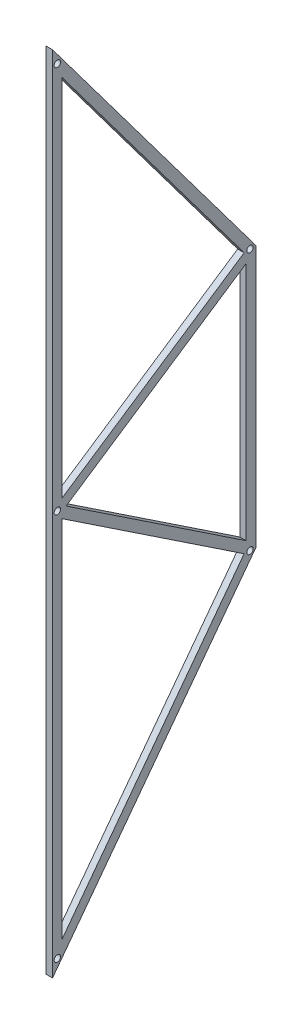
ISO-10303-21;
HEADER;
FILE_DESCRIPTION(('STEP AP214'),'2;1');
FILE_NAME('part.step','',(''),(''),'','','');
FILE_SCHEMA(('AUTOMOTIVE_DESIGN { 1 0 10303 214 1 1 1 1 }'));
ENDSEC;
DATA;
#1=APPLICATION_CONTEXT('core data for automotive mechanical design processes');
#2=APPLICATION_PROTOCOL_DEFINITION('international standard','automotive_design',2000,#1);
#3=PRODUCT_CONTEXT('',#1,'mechanical');
#4=PRODUCT('Part','Part','',(#3));
#5=PRODUCT_RELATED_PRODUCT_CATEGORY('part','',(#4));
#6=PRODUCT_DEFINITION_FORMATION('','',#4);
#7=PRODUCT_DEFINITION_CONTEXT('part definition',#1,'design');
#8=PRODUCT_DEFINITION('design','',#6,#7);
#9=PRODUCT_DEFINITION_SHAPE('','',#8);
#10=(LENGTH_UNIT() NAMED_UNIT(*) SI_UNIT(.MILLI.,.METRE.));
#11=(NAMED_UNIT(*) PLANE_ANGLE_UNIT() SI_UNIT($,.RADIAN.));
#12=(NAMED_UNIT(*) SI_UNIT($,.STERADIAN.) SOLID_ANGLE_UNIT());
#13=UNCERTAINTY_MEASURE_WITH_UNIT(LENGTH_MEASURE(1.E-05),#10,'distance_accuracy_value','');
#14=(GEOMETRIC_REPRESENTATION_CONTEXT(3) GLOBAL_UNCERTAINTY_ASSIGNED_CONTEXT((#13)) GLOBAL_UNIT_ASSIGNED_CONTEXT((#10,
#11,#12)) REPRESENTATION_CONTEXT('',''));
#15=CARTESIAN_POINT('',(0.,0.,0.));
#16=DIRECTION('',(0.,0.,1.));
#17=DIRECTION('',(1.,0.,0.));
#18=AXIS2_PLACEMENT_3D('',#15,#16,#17);
#19=CARTESIAN_POINT('',(10.,-220.5,-294.));
#20=DIRECTION('',(0.,0.6,0.8));
#21=DIRECTION('',(0.,-0.8,0.6));
#22=AXIS2_PLACEMENT_3D('',#19,#20,#21);
#23=PLANE('',#22);
#24=DIRECTION('',(0.,0.8,-0.6));
#25=VECTOR('',#24,1.);
#26=CARTESIAN_POINT('',(0.,-220.5,-294.));
#27=LINE('',#26,#25);
#28=CARTESIAN_POINT('',(0.,-622.5,7.50000000000001));
#29=VERTEX_POINT('',#28);
#30=CARTESIAN_POINT('',(0.,-202.5,-307.5));
#31=VERTEX_POINT('',#30);
#32=EDGE_CURVE('E193',#29,#31,#27,.T.);
#33=ORIENTED_EDGE('',*,*,#32,.T.);
#34=DIRECTION('',(-1.,0.,0.));
#35=VECTOR('',#34,1.);
#36=CARTESIAN_POINT('',(10.,-202.5,-307.5));
#37=LINE('',#36,#35);
#38=CARTESIAN_POINT('',(10.,-202.5,-307.5));
#39=VERTEX_POINT('',#38);
#40=EDGE_CURVE('E11',#39,#31,#37,.T.);
#41=ORIENTED_EDGE('',*,*,#40,.F.);
#42=DIRECTION('',(0.,0.8,-0.6));
#43=VECTOR('',#42,1.);
#44=CARTESIAN_POINT('',(10.,-220.5,-294.));
#45=LINE('',#44,#43);
#46=CARTESIAN_POINT('',(10.,-622.5,7.50000000000001));
#47=VERTEX_POINT('',#46);
#48=EDGE_CURVE('E149',#47,#39,#45,.T.);
#49=ORIENTED_EDGE('',*,*,#48,.F.);
#50=DIRECTION('',(-1.,0.,0.));
#51=VECTOR('',#50,1.);
#52=CARTESIAN_POINT('',(10.,-622.5,7.50000000000001));
#53=LINE('',#52,#51);
#54=EDGE_CURVE('E59',#47,#29,#53,.T.);
#55=ORIENTED_EDGE('',*,*,#54,.T.);
#56=EDGE_LOOP('',(#33,#41,#49,#55));
#57=FACE_BOUND('',#56,.T.);
#58=ADVANCED_FACE('F39',(#57),#23,.F.);
#59=CARTESIAN_POINT('',(10.,0.,-307.5));
#60=DIRECTION('',(0.,0.,1.));
#61=DIRECTION('',(0.,-1.,0.));
#62=AXIS2_PLACEMENT_3D('',#59,#60,#61);
#63=PLANE('',#62);
#64=DIRECTION('',(0.,1.,0.));
#65=VECTOR('',#64,1.);
#66=CARTESIAN_POINT('',(0.,0.,-307.5));
#67=LINE('',#66,#65);
#68=CARTESIAN_POINT('',(0.,202.5,-307.5));
#69=VERTEX_POINT('',#68);
#70=EDGE_CURVE('E154',#31,#69,#67,.T.);
#71=ORIENTED_EDGE('',*,*,#70,.T.);
#72=DIRECTION('',(-1.,0.,0.));
#73=VECTOR('',#72,1.);
#74=CARTESIAN_POINT('',(10.,202.5,-307.5));
#75=LINE('',#74,#73);
#76=CARTESIAN_POINT('',(10.,202.5,-307.5));
#77=VERTEX_POINT('',#76);
#78=EDGE_CURVE('E47',#77,#69,#75,.T.);
#79=ORIENTED_EDGE('',*,*,#78,.F.);
#80=DIRECTION('',(0.,1.,0.));
#81=VECTOR('',#80,1.);
#82=CARTESIAN_POINT('',(10.,0.,-307.5));
#83=LINE('',#82,#81);
#84=EDGE_CURVE('E141',#39,#77,#83,.T.);
#85=ORIENTED_EDGE('',*,*,#84,.F.);
#86=ORIENTED_EDGE('',*,*,#40,.T.);
#87=EDGE_LOOP('',(#71,#79,#85,#86));
#88=FACE_BOUND('',#87,.T.);
#89=ADVANCED_FACE('F152',(#88),#63,.F.);
#90=CARTESIAN_POINT('',(10.,220.5,-294.));
#91=DIRECTION('',(0.,0.6,-0.8));
#92=DIRECTION('',(0.,0.8,0.6));
#93=AXIS2_PLACEMENT_3D('',#90,#91,#92);
#94=PLANE('',#93);
#95=DIRECTION('',(0.,-0.8,-0.6));
#96=VECTOR('',#95,1.);
#97=CARTESIAN_POINT('',(0.,220.5,-294.));
#98=LINE('',#97,#96);
#99=CARTESIAN_POINT('',(0.,622.5,7.5));
#100=VERTEX_POINT('',#99);
#101=EDGE_CURVE('E197',#100,#69,#98,.T.);
#102=ORIENTED_EDGE('',*,*,#101,.F.);
#103=DIRECTION('',(-1.,0.,0.));
#104=VECTOR('',#103,1.);
#105=CARTESIAN_POINT('',(10.,622.5,7.5));
#106=LINE('',#105,#104);
#107=CARTESIAN_POINT('',(10.,622.5,7.5));
#108=VERTEX_POINT('',#107);
#109=EDGE_CURVE('E97',#108,#100,#106,.T.);
#110=ORIENTED_EDGE('',*,*,#109,.F.);
#111=DIRECTION('',(0.,-0.8,-0.6));
#112=VECTOR('',#111,1.);
#113=CARTESIAN_POINT('',(10.,220.5,-294.));
#114=LINE('',#113,#112);
#115=EDGE_CURVE('E146',#108,#77,#114,.T.);
#116=ORIENTED_EDGE('',*,*,#115,.T.);
#117=ORIENTED_EDGE('',*,*,#78,.T.);
#118=EDGE_LOOP('',(#102,#110,#116,#117));
#119=FACE_BOUND('',#118,.T.);
#120=ADVANCED_FACE('F157',(#119),#94,.T.);
#121=CARTESIAN_POINT('',(10.,0.,-292.5));
#122=DIRECTION('',(0.,0.,1.));
#123=DIRECTION('',(1.,0.,0.));
#124=AXIS2_PLACEMENT_3D('',#121,#122,#123);
#125=PLANE('',#124);
#126=DIRECTION('',(0.,1.,0.));
#127=VECTOR('',#126,1.);
#128=CARTESIAN_POINT('',(0.,0.,-292.5));
#129=LINE('',#128,#127);
#130=CARTESIAN_POINT('',(0.,-185.98612181134,-292.5));
#131=VERTEX_POINT('',#130);
#132=CARTESIAN_POINT('',(0.,185.98612181134,-292.5));
#133=VERTEX_POINT('',#132);
#134=EDGE_CURVE('E183',#131,#133,#129,.T.);
#135=ORIENTED_EDGE('',*,*,#134,.F.);
#136=DIRECTION('',(-1.,0.,0.));
#137=VECTOR('',#136,1.);
#138=CARTESIAN_POINT('',(10.,-185.98612181134,-292.5));
#139=LINE('',#138,#137);
#140=CARTESIAN_POINT('',(10.,-185.98612181134,-292.5));
#141=VERTEX_POINT('',#140);
#142=EDGE_CURVE('E204',#141,#131,#139,.T.);
#143=ORIENTED_EDGE('',*,*,#142,.F.);
#144=DIRECTION('',(0.,1.,0.));
#145=VECTOR('',#144,1.);
#146=CARTESIAN_POINT('',(10.,0.,-292.5));
#147=LINE('',#146,#145);
#148=CARTESIAN_POINT('',(10.,185.98612181134,-292.5));
#149=VERTEX_POINT('',#148);
#150=EDGE_CURVE('E250',#141,#149,#147,.T.);
#151=ORIENTED_EDGE('',*,*,#150,.T.);
#152=DIRECTION('',(-1.,0.,0.));
#153=VECTOR('',#152,1.);
#154=CARTESIAN_POINT('',(10.,185.98612181134,-292.5));
#155=LINE('',#154,#153);
#156=EDGE_CURVE('E206',#149,#133,#155,.T.);
#157=ORIENTED_EDGE('',*,*,#156,.T.);
#158=EDGE_LOOP('',(#135,#143,#151,#157));
#159=FACE_BOUND('',#158,.T.);
#160=ADVANCED_FACE('F262',(#159),#125,.T.);
#161=CARTESIAN_POINT('',(10.,6.24037720753383,-4.16025147168922));
#162=DIRECTION('',(0.,0.832050294337844,-0.554700196225229));
#163=DIRECTION('',(0.,0.554700196225229,0.832050294337844));
#164=AXIS2_PLACEMENT_3D('',#161,#162,#163);
#165=PLANE('',#164);
#166=DIRECTION('',(0.,-0.554700196225229,-0.832050294337844));
#167=VECTOR('',#166,1.);
#168=CARTESIAN_POINT('',(0.,6.24037720753383,-4.16025147168922));
#169=LINE('',#168,#167);
#170=CARTESIAN_POINT('',(0.,0.,-13.52081728299));
#171=VERTEX_POINT('',#170);
#172=EDGE_CURVE('E187',#171,#131,#169,.T.);
#173=ORIENTED_EDGE('',*,*,#172,.F.);
#174=DIRECTION('',(-1.,0.,0.));
#175=VECTOR('',#174,1.);
#176=CARTESIAN_POINT('',(10.,0.,-13.52081728299));
#177=LINE('',#176,#175);
#178=CARTESIAN_POINT('',(10.,0.,-13.52081728299));
#179=VERTEX_POINT('',#178);
#180=EDGE_CURVE('E208',#179,#171,#177,.T.);
#181=ORIENTED_EDGE('',*,*,#180,.F.);
#182=DIRECTION('',(0.,-0.554700196225229,-0.832050294337844));
#183=VECTOR('',#182,1.);
#184=CARTESIAN_POINT('',(10.,6.24037720753383,-4.16025147168922));
#185=LINE('',#184,#183);
#186=EDGE_CURVE('E249',#179,#141,#185,.T.);
#187=ORIENTED_EDGE('',*,*,#186,.T.);
#188=ORIENTED_EDGE('',*,*,#142,.T.);
#189=EDGE_LOOP('',(#173,#181,#187,#188));
#190=FACE_BOUND('',#189,.T.);
#191=ADVANCED_FACE('F270',(#190),#165,.T.);
#192=CARTESIAN_POINT('',(10.,6.24037720753386,4.16025147168924));
#193=DIRECTION('',(0.,0.832050294337844,0.554700196225229));
#194=DIRECTION('',(0.,-0.554700196225229,0.832050294337844));
#195=AXIS2_PLACEMENT_3D('',#192,#193,#194);
#196=PLANE('',#195);
#197=DIRECTION('',(0.,0.554700196225229,-0.832050294337844));
#198=VECTOR('',#197,1.);
#199=CARTESIAN_POINT('',(0.,6.24037720753386,4.16025147168924));
#200=LINE('',#199,#198);
#201=CARTESIAN_POINT('',(0.,14.01387818866,-7.5));
#202=VERTEX_POINT('',#201);
#203=CARTESIAN_POINT('',(0.,201.842585459107,-289.24306090567));
#204=VERTEX_POINT('',#203);
#205=EDGE_CURVE('E176',#202,#204,#200,.T.);
#206=ORIENTED_EDGE('',*,*,#205,.F.);
#207=DIRECTION('',(-1.,0.,0.));
#208=VECTOR('',#207,1.);
#209=CARTESIAN_POINT('',(10.,14.01387818866,-7.5));
#210=LINE('',#209,#208);
#211=CARTESIAN_POINT('',(10.,14.01387818866,-7.5));
#212=VERTEX_POINT('',#211);
#213=EDGE_CURVE('E207',#212,#202,#210,.T.);
#214=ORIENTED_EDGE('',*,*,#213,.F.);
#215=DIRECTION('',(0.,0.554700196225229,-0.832050294337844));
#216=VECTOR('',#215,1.);
#217=CARTESIAN_POINT('',(10.,6.24037720753386,4.16025147168924));
#218=LINE('',#217,#216);
#219=CARTESIAN_POINT('',(10.,201.842585459107,-289.24306090567));
#220=VERTEX_POINT('',#219);
#221=EDGE_CURVE('E237',#212,#220,#218,.T.);
#222=ORIENTED_EDGE('',*,*,#221,.T.);
#223=DIRECTION('',(-1.,0.,0.));
#224=VECTOR('',#223,1.);
#225=CARTESIAN_POINT('',(10.,201.842585459107,-289.24306090567));
#226=LINE('',#225,#224);
#227=EDGE_CURVE('E215',#220,#204,#226,.T.);
#228=ORIENTED_EDGE('',*,*,#227,.T.);
#229=EDGE_LOOP('',(#206,#214,#222,#228));
#230=FACE_BOUND('',#229,.T.);
#231=ADVANCED_FACE('F300',(#230),#196,.T.);
#232=CARTESIAN_POINT('',(10.,0.,-7.5));
#233=DIRECTION('',(0.,0.,1.));
#234=DIRECTION('',(0.,-1.,0.));
#235=AXIS2_PLACEMENT_3D('',#232,#233,#234);
#236=PLANE('',#235);
#237=DIRECTION('',(0.,1.,0.));
#238=VECTOR('',#237,1.);
#239=CARTESIAN_POINT('',(0.,0.,-7.5));
#240=LINE('',#239,#238);
#241=CARTESIAN_POINT('',(0.,577.5,-7.5));
#242=VERTEX_POINT('',#241);
#243=EDGE_CURVE('E178',#202,#242,#240,.T.);
#244=ORIENTED_EDGE('',*,*,#243,.T.);
#245=DIRECTION('',(-1.,0.,0.));
#246=VECTOR('',#245,1.);
#247=CARTESIAN_POINT('',(10.,577.5,-7.5));
#248=LINE('',#247,#246);
#249=CARTESIAN_POINT('',(10.,577.5,-7.5));
#250=VERTEX_POINT('',#249);
#251=EDGE_CURVE('E212',#250,#242,#248,.T.);
#252=ORIENTED_EDGE('',*,*,#251,.F.);
#253=DIRECTION('',(0.,1.,0.));
#254=VECTOR('',#253,1.);
#255=CARTESIAN_POINT('',(10.,0.,-7.5));
#256=LINE('',#255,#254);
#257=EDGE_CURVE('E239',#212,#250,#256,.T.);
#258=ORIENTED_EDGE('',*,*,#257,.F.);
#259=ORIENTED_EDGE('',*,*,#213,.T.);
#260=EDGE_LOOP('',(#244,#252,#258,#259));
#261=FACE_BOUND('',#260,.T.);
#262=ADVANCED_FACE('F302',(#261),#236,.F.);
#263=CARTESIAN_POINT('',(10.,0.,-7.5));
#264=DIRECTION('',(0.,0.,1.));
#265=DIRECTION('',(0.,-1.,0.));
#266=AXIS2_PLACEMENT_3D('',#263,#264,#265);
#267=PLANE('',#266);
#268=DIRECTION('',(0.,1.,0.));
#269=VECTOR('',#268,1.);
#270=CARTESIAN_POINT('',(0.,0.,-7.5));
#271=LINE('',#270,#269);
#272=CARTESIAN_POINT('',(0.,-577.5,-7.49999999999995));
#273=VERTEX_POINT('',#272);
#274=CARTESIAN_POINT('',(0.,-14.01387818866,-7.5));
#275=VERTEX_POINT('',#274);
#276=EDGE_CURVE('E167',#273,#275,#271,.T.);
#277=ORIENTED_EDGE('',*,*,#276,.T.);
#278=DIRECTION('',(-1.,0.,0.));
#279=VECTOR('',#278,1.);
#280=CARTESIAN_POINT('',(10.,-14.01387818866,-7.5));
#281=LINE('',#280,#279);
#282=CARTESIAN_POINT('',(10.,-14.01387818866,-7.5));
#283=VERTEX_POINT('',#282);
#284=EDGE_CURVE('E43',#283,#275,#281,.T.);
#285=ORIENTED_EDGE('',*,*,#284,.F.);
#286=DIRECTION('',(0.,1.,0.));
#287=VECTOR('',#286,1.);
#288=CARTESIAN_POINT('',(10.,0.,-7.5));
#289=LINE('',#288,#287);
#290=CARTESIAN_POINT('',(10.,-577.5,-7.49999999999995));
#291=VERTEX_POINT('',#290);
#292=EDGE_CURVE('E205',#291,#283,#289,.T.);
#293=ORIENTED_EDGE('',*,*,#292,.F.);
#294=DIRECTION('',(-1.,0.,0.));
#295=VECTOR('',#294,1.);
#296=CARTESIAN_POINT('',(10.,-577.5,-7.49999999999995));
#297=LINE('',#296,#295);
#298=EDGE_CURVE('E165',#291,#273,#297,.T.);
#299=ORIENTED_EDGE('',*,*,#298,.T.);
#300=EDGE_LOOP('',(#277,#285,#293,#299));
#301=FACE_BOUND('',#300,.T.);
#302=ADVANCED_FACE('F41',(#301),#267,.F.);
#303=CARTESIAN_POINT('',(10.,-6.24037720753386,4.16025147168924));
#304=DIRECTION('',(0.,0.832050294337844,-0.554700196225229));
#305=DIRECTION('',(0.,0.554700196225229,0.832050294337844));
#306=AXIS2_PLACEMENT_3D('',#303,#304,#305);
#307=PLANE('',#306);
#308=DIRECTION('',(0.,-0.554700196225229,-0.832050294337844));
#309=VECTOR('',#308,1.);
#310=CARTESIAN_POINT('',(0.,-6.24037720753386,4.16025147168924));
#311=LINE('',#310,#309);
#312=CARTESIAN_POINT('',(0.,-201.842585459107,-289.24306090567));
#313=VERTEX_POINT('',#312);
#314=EDGE_CURVE('E166',#275,#313,#311,.T.);
#315=ORIENTED_EDGE('',*,*,#314,.T.);
#316=DIRECTION('',(-1.,0.,0.));
#317=VECTOR('',#316,1.);
#318=CARTESIAN_POINT('',(10.,-201.842585459107,-289.24306090567));
#319=LINE('',#318,#317);
#320=CARTESIAN_POINT('',(10.,-201.842585459107,-289.24306090567));
#321=VERTEX_POINT('',#320);
#322=EDGE_CURVE('E217',#321,#313,#319,.T.);
#323=ORIENTED_EDGE('',*,*,#322,.F.);
#324=DIRECTION('',(0.,-0.554700196225229,-0.832050294337844));
#325=VECTOR('',#324,1.);
#326=CARTESIAN_POINT('',(10.,-6.24037720753386,4.16025147168924));
#327=LINE('',#326,#325);
#328=EDGE_CURVE('E115',#283,#321,#327,.T.);
#329=ORIENTED_EDGE('',*,*,#328,.F.);
#330=ORIENTED_EDGE('',*,*,#284,.T.);
#331=EDGE_LOOP('',(#315,#323,#329,#330));
#332=FACE_BOUND('',#331,.T.);
#333=ADVANCED_FACE('F224',(#332),#307,.F.);
#334=CARTESIAN_POINT('',(10.,-6.24037720753382,-4.16025147168922));
#335=DIRECTION('',(0.,0.832050294337844,0.554700196225229));
#336=DIRECTION('',(0.,-0.554700196225229,0.832050294337844));
#337=AXIS2_PLACEMENT_3D('',#334,#335,#336);
#338=PLANE('',#337);
#339=DIRECTION('',(0.,0.554700196225229,-0.832050294337844));
#340=VECTOR('',#339,1.);
#341=CARTESIAN_POINT('',(0.,-6.24037720753382,-4.16025147168922));
#342=LINE('',#341,#340);
#343=EDGE_CURVE('E191',#171,#133,#342,.T.);
#344=ORIENTED_EDGE('',*,*,#343,.T.);
#345=ORIENTED_EDGE('',*,*,#156,.F.);
#346=DIRECTION('',(0.,0.554700196225229,-0.832050294337844));
#347=VECTOR('',#346,1.);
#348=CARTESIAN_POINT('',(10.,-6.24037720753382,-4.16025147168922));
#349=LINE('',#348,#347);
#350=EDGE_CURVE('E251',#179,#149,#349,.T.);
#351=ORIENTED_EDGE('',*,*,#350,.F.);
#352=ORIENTED_EDGE('',*,*,#180,.T.);
#353=EDGE_LOOP('',(#344,#345,#351,#352));
#354=FACE_BOUND('',#353,.T.);
#355=ADVANCED_FACE('F257',(#354),#338,.F.);
#356=CARTESIAN_POINT('',(10.,211.5,-282.));
#357=DIRECTION('',(0.,0.6,-0.8));
#358=DIRECTION('',(0.,0.8,0.6));
#359=AXIS2_PLACEMENT_3D('',#356,#357,#358);
#360=PLANE('',#359);
#361=DIRECTION('',(0.,-0.8,-0.6));
#362=VECTOR('',#361,1.);
#363=CARTESIAN_POINT('',(0.,211.5,-282.));
#364=LINE('',#363,#362);
#365=EDGE_CURVE('E185',#242,#204,#364,.T.);
#366=ORIENTED_EDGE('',*,*,#365,.T.);
#367=ORIENTED_EDGE('',*,*,#227,.F.);
#368=DIRECTION('',(0.,-0.8,-0.6));
#369=VECTOR('',#368,1.);
#370=CARTESIAN_POINT('',(10.,211.5,-282.));
#371=LINE('',#370,#369);
#372=EDGE_CURVE('E244',#250,#220,#371,.T.);
#373=ORIENTED_EDGE('',*,*,#372,.F.);
#374=ORIENTED_EDGE('',*,*,#251,.T.);
#375=EDGE_LOOP('',(#366,#367,#373,#374));
#376=FACE_BOUND('',#375,.T.);
#377=ADVANCED_FACE('F282',(#376),#360,.F.);
#378=CARTESIAN_POINT('',(10.,-211.5,-282.));
#379=DIRECTION('',(0.,0.6,0.8));
#380=DIRECTION('',(0.,-0.8,0.6));
#381=AXIS2_PLACEMENT_3D('',#378,#379,#380);
#382=PLANE('',#381);
#383=DIRECTION('',(0.,0.8,-0.6));
#384=VECTOR('',#383,1.);
#385=CARTESIAN_POINT('',(0.,-211.5,-282.));
#386=LINE('',#385,#384);
#387=EDGE_CURVE('E172',#273,#313,#386,.T.);
#388=ORIENTED_EDGE('',*,*,#387,.F.);
#389=ORIENTED_EDGE('',*,*,#298,.F.);
#390=DIRECTION('',(0.,0.8,-0.6));
#391=VECTOR('',#390,1.);
#392=CARTESIAN_POINT('',(10.,-211.5,-282.));
#393=LINE('',#392,#391);
#394=EDGE_CURVE('E235',#291,#321,#393,.T.);
#395=ORIENTED_EDGE('',*,*,#394,.T.);
#396=ORIENTED_EDGE('',*,*,#322,.T.);
#397=EDGE_LOOP('',(#388,#389,#395,#396));
#398=FACE_BOUND('',#397,.T.);
#399=ADVANCED_FACE('F229',(#398),#382,.T.);
#400=CARTESIAN_POINT('',(10.,0.,7.5));
#401=DIRECTION('',(0.,0.,1.));
#402=DIRECTION('',(0.,-1.,0.));
#403=AXIS2_PLACEMENT_3D('',#400,#401,#402);
#404=PLANE('',#403);
#405=DIRECTION('',(0.,1.,0.));
#406=VECTOR('',#405,1.);
#407=CARTESIAN_POINT('',(0.,0.,7.5));
#408=LINE('',#407,#406);
#409=EDGE_CURVE('E200',#29,#100,#408,.T.);
#410=ORIENTED_EDGE('',*,*,#409,.F.);
#411=ORIENTED_EDGE('',*,*,#54,.F.);
#412=DIRECTION('',(0.,1.,0.));
#413=VECTOR('',#412,1.);
#414=CARTESIAN_POINT('',(10.,0.,7.5));
#415=LINE('',#414,#413);
#416=EDGE_CURVE('E159',#47,#108,#415,.T.);
#417=ORIENTED_EDGE('',*,*,#416,.T.);
#418=ORIENTED_EDGE('',*,*,#109,.T.);
#419=EDGE_LOOP('',(#410,#411,#417,#418));
#420=FACE_BOUND('',#419,.T.);
#421=ADVANCED_FACE('F273',(#420),#404,.T.);
#422=CARTESIAN_POINT('',(10.,0.,0.));
#423=DIRECTION('',(1.,0.,0.));
#424=DIRECTION('',(0.,0.,-1.));
#425=AXIS2_PLACEMENT_3D('',#422,#423,#424);
#426=PLANE('',#425);
#427=CARTESIAN_POINT('',(10.,600.,0.));
#428=DIRECTION('',(1.,0.,0.));
#429=DIRECTION('',(0.,0.,-1.));
#430=AXIS2_PLACEMENT_3D('',#427,#428,#429);
#431=CIRCLE('',#430,5.00000000000004);
#432=CARTESIAN_POINT('',(10.,600.,-5.00000000000002));
#433=VERTEX_POINT('',#432);
#434=EDGE_CURVE('E495',#433,#433,#431,.T.);
#435=ORIENTED_EDGE('',*,*,#434,.F.);
#436=EDGE_LOOP('',(#435));
#437=FACE_BOUND('',#436,.T.);
#438=CARTESIAN_POINT('',(10.,202.27461011694,-298.294042412295));
#439=DIRECTION('',(1.,0.,0.));
#440=DIRECTION('',(0.,0.,-1.));
#441=AXIS2_PLACEMENT_3D('',#438,#439,#440);
#442=CIRCLE('',#441,5.00000000000002);
#443=CARTESIAN_POINT('',(10.,202.27461011694,-303.294042412295));
#444=VERTEX_POINT('',#443);
#445=EDGE_CURVE('E497',#444,#444,#442,.T.);
#446=ORIENTED_EDGE('',*,*,#445,.F.);
#447=EDGE_LOOP('',(#446));
#448=FACE_BOUND('',#447,.T.);
#449=CARTESIAN_POINT('',(10.,-202.27461011694,-298.294042412295));
#450=DIRECTION('',(1.,0.,0.));
#451=DIRECTION('',(0.,0.,-1.));
#452=AXIS2_PLACEMENT_3D('',#449,#450,#451);
#453=CIRCLE('',#452,4.99999999999999);
#454=CARTESIAN_POINT('',(10.,-202.27461011694,-303.294042412295));
#455=VERTEX_POINT('',#454);
#456=EDGE_CURVE('E514',#455,#455,#453,.T.);
#457=ORIENTED_EDGE('',*,*,#456,.F.);
#458=EDGE_LOOP('',(#457));
#459=FACE_BOUND('',#458,.T.);
#460=CARTESIAN_POINT('',(10.,-600.,-1.11889664200504E-13));
#461=DIRECTION('',(1.,0.,0.));
#462=DIRECTION('',(0.,0.,-1.));
#463=AXIS2_PLACEMENT_3D('',#460,#461,#462);
#464=CIRCLE('',#463,5.00000000000004);
#465=CARTESIAN_POINT('',(10.,-600.,-5.00000000000016));
#466=VERTEX_POINT('',#465);
#467=EDGE_CURVE('E504',#466,#466,#464,.T.);
#468=ORIENTED_EDGE('',*,*,#467,.F.);
#469=EDGE_LOOP('',(#468));
#470=FACE_BOUND('',#469,.T.);
#471=CARTESIAN_POINT('',(10.,0.,0.));
#472=DIRECTION('',(1.,0.,0.));
#473=DIRECTION('',(0.,0.,-1.));
#474=AXIS2_PLACEMENT_3D('',#471,#472,#473);
#475=CIRCLE('',#474,5.);
#476=CARTESIAN_POINT('',(10.,0.,-5.));
#477=VERTEX_POINT('',#476);
#478=EDGE_CURVE('E502',#477,#477,#475,.T.);
#479=ORIENTED_EDGE('',*,*,#478,.F.);
#480=EDGE_LOOP('',(#479));
#481=FACE_BOUND('',#480,.T.);
#482=ORIENTED_EDGE('',*,*,#292,.T.);
#483=ORIENTED_EDGE('',*,*,#328,.T.);
#484=ORIENTED_EDGE('',*,*,#394,.F.);
#485=EDGE_LOOP('',(#482,#483,#484));
#486=FACE_BOUND('',#485,.T.);
#487=ORIENTED_EDGE('',*,*,#221,.F.);
#488=ORIENTED_EDGE('',*,*,#257,.T.);
#489=ORIENTED_EDGE('',*,*,#372,.T.);
#490=EDGE_LOOP('',(#487,#488,#489));
#491=FACE_BOUND('',#490,.T.);
#492=ORIENTED_EDGE('',*,*,#150,.F.);
#493=ORIENTED_EDGE('',*,*,#186,.F.);
#494=ORIENTED_EDGE('',*,*,#350,.T.);
#495=EDGE_LOOP('',(#492,#493,#494));
#496=FACE_BOUND('',#495,.T.);
#497=ORIENTED_EDGE('',*,*,#48,.T.);
#498=ORIENTED_EDGE('',*,*,#84,.T.);
#499=ORIENTED_EDGE('',*,*,#115,.F.);
#500=ORIENTED_EDGE('',*,*,#416,.F.);
#501=EDGE_LOOP('',(#497,#498,#499,#500));
#502=FACE_BOUND('',#501,.T.);
#503=ADVANCED_FACE('F144',(#437,#448,#459,#470,#481,#486,#491,#496,#502),#426,.T.);
#504=CARTESIAN_POINT('',(0.,0.,0.));
#505=DIRECTION('',(1.,0.,0.));
#506=DIRECTION('',(0.,0.,-1.));
#507=AXIS2_PLACEMENT_3D('',#504,#505,#506);
#508=PLANE('',#507);
#509=CARTESIAN_POINT('',(0.,600.,0.));
#510=DIRECTION('',(1.,0.,0.));
#511=DIRECTION('',(0.,0.,-1.));
#512=AXIS2_PLACEMENT_3D('',#509,#510,#511);
#513=CIRCLE('',#512,5.00000000000004);
#514=CARTESIAN_POINT('',(0.,600.,-5.00000000000002));
#515=VERTEX_POINT('',#514);
#516=EDGE_CURVE('E487',#515,#515,#513,.T.);
#517=ORIENTED_EDGE('',*,*,#516,.T.);
#518=EDGE_LOOP('',(#517));
#519=FACE_BOUND('',#518,.T.);
#520=CARTESIAN_POINT('',(0.,202.27461011694,-298.294042412295));
#521=DIRECTION('',(1.,0.,0.));
#522=DIRECTION('',(0.,0.,-1.));
#523=AXIS2_PLACEMENT_3D('',#520,#521,#522);
#524=CIRCLE('',#523,5.00000000000002);
#525=CARTESIAN_POINT('',(0.,202.27461011694,-303.294042412295));
#526=VERTEX_POINT('',#525);
#527=EDGE_CURVE('E492',#526,#526,#524,.T.);
#528=ORIENTED_EDGE('',*,*,#527,.T.);
#529=EDGE_LOOP('',(#528));
#530=FACE_BOUND('',#529,.T.);
#531=CARTESIAN_POINT('',(0.,-202.27461011694,-298.294042412295));
#532=DIRECTION('',(1.,0.,0.));
#533=DIRECTION('',(0.,0.,-1.));
#534=AXIS2_PLACEMENT_3D('',#531,#532,#533);
#535=CIRCLE('',#534,4.99999999999999);
#536=CARTESIAN_POINT('',(0.,-202.27461011694,-303.294042412295));
#537=VERTEX_POINT('',#536);
#538=EDGE_CURVE('E518',#537,#537,#535,.T.);
#539=ORIENTED_EDGE('',*,*,#538,.T.);
#540=EDGE_LOOP('',(#539));
#541=FACE_BOUND('',#540,.T.);
#542=CARTESIAN_POINT('',(0.,-600.,-1.11889664200504E-13));
#543=DIRECTION('',(1.,0.,0.));
#544=DIRECTION('',(0.,0.,-1.));
#545=AXIS2_PLACEMENT_3D('',#542,#543,#544);
#546=CIRCLE('',#545,5.00000000000004);
#547=CARTESIAN_POINT('',(0.,-600.,-5.00000000000016));
#548=VERTEX_POINT('',#547);
#549=EDGE_CURVE('E508',#548,#548,#546,.T.);
#550=ORIENTED_EDGE('',*,*,#549,.T.);
#551=EDGE_LOOP('',(#550));
#552=FACE_BOUND('',#551,.T.);
#553=CARTESIAN_POINT('',(0.,0.,0.));
#554=DIRECTION('',(1.,0.,0.));
#555=DIRECTION('',(0.,0.,-1.));
#556=AXIS2_PLACEMENT_3D('',#553,#554,#555);
#557=CIRCLE('',#556,5.);
#558=CARTESIAN_POINT('',(0.,0.,-5.));
#559=VERTEX_POINT('',#558);
#560=EDGE_CURVE('E168',#559,#559,#557,.T.);
#561=ORIENTED_EDGE('',*,*,#560,.T.);
#562=EDGE_LOOP('',(#561));
#563=FACE_BOUND('',#562,.T.);
#564=ORIENTED_EDGE('',*,*,#276,.F.);
#565=ORIENTED_EDGE('',*,*,#387,.T.);
#566=ORIENTED_EDGE('',*,*,#314,.F.);
#567=EDGE_LOOP('',(#564,#565,#566));
#568=FACE_BOUND('',#567,.T.);
#569=ORIENTED_EDGE('',*,*,#205,.T.);
#570=ORIENTED_EDGE('',*,*,#365,.F.);
#571=ORIENTED_EDGE('',*,*,#243,.F.);
#572=EDGE_LOOP('',(#569,#570,#571));
#573=FACE_BOUND('',#572,.T.);
#574=ORIENTED_EDGE('',*,*,#134,.T.);
#575=ORIENTED_EDGE('',*,*,#343,.F.);
#576=ORIENTED_EDGE('',*,*,#172,.T.);
#577=EDGE_LOOP('',(#574,#575,#576));
#578=FACE_BOUND('',#577,.T.);
#579=ORIENTED_EDGE('',*,*,#32,.F.);
#580=ORIENTED_EDGE('',*,*,#409,.T.);
#581=ORIENTED_EDGE('',*,*,#101,.T.);
#582=ORIENTED_EDGE('',*,*,#70,.F.);
#583=EDGE_LOOP('',(#579,#580,#581,#582));
#584=FACE_BOUND('',#583,.T.);
#585=ADVANCED_FACE('F227',(#519,#530,#541,#552,#563,#568,#573,#578,#584),#508,.F.);
#586=CARTESIAN_POINT('',(0.,0.,0.));
#587=DIRECTION('',(1.,0.,0.));
#588=DIRECTION('',(0.,0.,-1.));
#589=AXIS2_PLACEMENT_3D('',#586,#587,#588);
#590=CYLINDRICAL_SURFACE('',#589,5.);
#591=ORIENTED_EDGE('',*,*,#560,.F.);
#592=EDGE_LOOP('',(#591));
#593=FACE_BOUND('',#592,.T.);
#594=ORIENTED_EDGE('',*,*,#478,.T.);
#595=EDGE_LOOP('',(#594));
#596=FACE_BOUND('',#595,.T.);
#597=ADVANCED_FACE('F271',(#593,#596),#590,.F.);
#598=CARTESIAN_POINT('',(0.,-600.,-1.11889664200504E-13));
#599=DIRECTION('',(1.,0.,0.));
#600=DIRECTION('',(0.,0.,-1.));
#601=AXIS2_PLACEMENT_3D('',#598,#599,#600);
#602=CYLINDRICAL_SURFACE('',#601,5.00000000000004);
#603=ORIENTED_EDGE('',*,*,#549,.F.);
#604=EDGE_LOOP('',(#603));
#605=FACE_BOUND('',#604,.T.);
#606=ORIENTED_EDGE('',*,*,#467,.T.);
#607=EDGE_LOOP('',(#606));
#608=FACE_BOUND('',#607,.T.);
#609=ADVANCED_FACE('F402',(#605,#608),#602,.F.);
#610=CARTESIAN_POINT('',(0.,-202.27461011694,-298.294042412295));
#611=DIRECTION('',(1.,0.,0.));
#612=DIRECTION('',(0.,0.,-1.));
#613=AXIS2_PLACEMENT_3D('',#610,#611,#612);
#614=CYLINDRICAL_SURFACE('',#613,4.99999999999999);
#615=ORIENTED_EDGE('',*,*,#538,.F.);
#616=EDGE_LOOP('',(#615));
#617=FACE_BOUND('',#616,.T.);
#618=ORIENTED_EDGE('',*,*,#456,.T.);
#619=EDGE_LOOP('',(#618));
#620=FACE_BOUND('',#619,.T.);
#621=ADVANCED_FACE('F411',(#617,#620),#614,.F.);
#622=CARTESIAN_POINT('',(0.,202.27461011694,-298.294042412295));
#623=DIRECTION('',(1.,0.,0.));
#624=DIRECTION('',(0.,0.,-1.));
#625=AXIS2_PLACEMENT_3D('',#622,#623,#624);
#626=CYLINDRICAL_SURFACE('',#625,5.00000000000002);
#627=ORIENTED_EDGE('',*,*,#527,.F.);
#628=EDGE_LOOP('',(#627));
#629=FACE_BOUND('',#628,.T.);
#630=ORIENTED_EDGE('',*,*,#445,.T.);
#631=EDGE_LOOP('',(#630));
#632=FACE_BOUND('',#631,.T.);
#633=ADVANCED_FACE('F419',(#629,#632),#626,.F.);
#634=CARTESIAN_POINT('',(0.,600.,0.));
#635=DIRECTION('',(1.,0.,0.));
#636=DIRECTION('',(0.,0.,-1.));
#637=AXIS2_PLACEMENT_3D('',#634,#635,#636);
#638=CYLINDRICAL_SURFACE('',#637,5.00000000000004);
#639=ORIENTED_EDGE('',*,*,#516,.F.);
#640=EDGE_LOOP('',(#639));
#641=FACE_BOUND('',#640,.T.);
#642=ORIENTED_EDGE('',*,*,#434,.T.);
#643=EDGE_LOOP('',(#642));
#644=FACE_BOUND('',#643,.T.);
#645=ADVANCED_FACE('F427',(#641,#644),#638,.F.);
#646=CLOSED_SHELL('',(#58,#89,#120,#160,#191,#231,#262,#302,#333,#355,#377,#399,#421,#503,#585,
#597,#609,#621,#633,#645));
#647=MANIFOLD_SOLID_BREP('B2',#646);
#648=ADVANCED_BREP_SHAPE_REPRESENTATION('',(#18,#647),#14);
#649=SHAPE_DEFINITION_REPRESENTATION(#9,#648);
ENDSEC;
END-ISO-10303-21;
